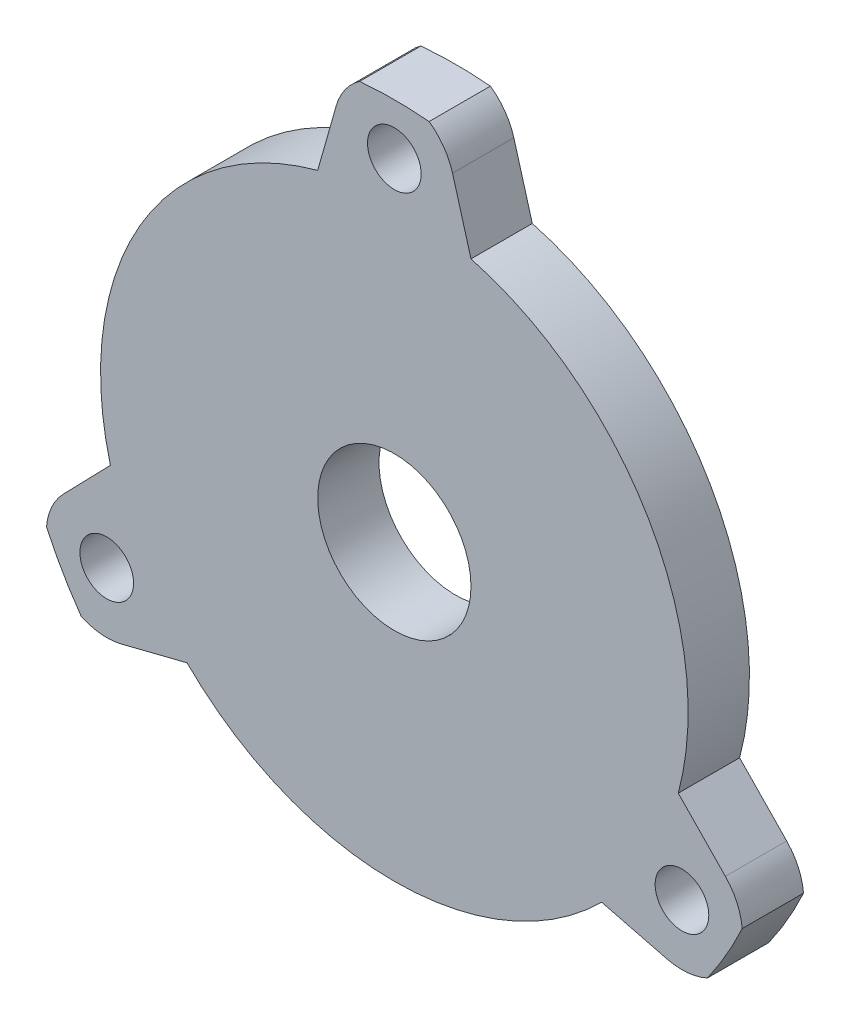
ISO-10303-21;
HEADER;
FILE_DESCRIPTION(('STEP AP214'),'2;1');
FILE_NAME('part.step','',(''),(''),'','','');
FILE_SCHEMA(('AUTOMOTIVE_DESIGN { 1 0 10303 214 1 1 1 1 }'));
ENDSEC;
DATA;
#1=APPLICATION_CONTEXT('core data for automotive mechanical design processes');
#2=APPLICATION_PROTOCOL_DEFINITION('international standard','automotive_design',2000,#1);
#3=PRODUCT_CONTEXT('',#1,'mechanical');
#4=PRODUCT('Part','Part','',(#3));
#5=PRODUCT_RELATED_PRODUCT_CATEGORY('part','',(#4));
#6=PRODUCT_DEFINITION_FORMATION('','',#4);
#7=PRODUCT_DEFINITION_CONTEXT('part definition',#1,'design');
#8=PRODUCT_DEFINITION('design','',#6,#7);
#9=PRODUCT_DEFINITION_SHAPE('','',#8);
#10=(LENGTH_UNIT() NAMED_UNIT(*) SI_UNIT(.MILLI.,.METRE.));
#11=(NAMED_UNIT(*) PLANE_ANGLE_UNIT() SI_UNIT($,.RADIAN.));
#12=(NAMED_UNIT(*) SI_UNIT($,.STERADIAN.) SOLID_ANGLE_UNIT());
#13=UNCERTAINTY_MEASURE_WITH_UNIT(LENGTH_MEASURE(1.E-05),#10,'distance_accuracy_value','');
#14=(GEOMETRIC_REPRESENTATION_CONTEXT(3) GLOBAL_UNCERTAINTY_ASSIGNED_CONTEXT((#13)) GLOBAL_UNIT_ASSIGNED_CONTEXT((#10,
#11,#12)) REPRESENTATION_CONTEXT('',''));
#15=CARTESIAN_POINT('',(0.,0.,0.));
#16=DIRECTION('',(0.,0.,1.));
#17=DIRECTION('',(1.,0.,0.));
#18=AXIS2_PLACEMENT_3D('',#15,#16,#17);
#19=CARTESIAN_POINT('',(0.,0.,6.));
#20=DIRECTION('',(0.,0.,1.));
#21=DIRECTION('',(1.,0.,0.));
#22=AXIS2_PLACEMENT_3D('',#19,#20,#21);
#23=PLANE('',#22);
#24=CARTESIAN_POINT('',(0.,0.,6.));
#25=DIRECTION('',(0.,0.,1.));
#26=DIRECTION('',(1.,0.,0.));
#27=AXIS2_PLACEMENT_3D('',#24,#25,#26);
#28=CIRCLE('',#27,15.);
#29=CARTESIAN_POINT('',(15.,0.,6.));
#30=VERTEX_POINT('',#29);
#31=EDGE_CURVE('E282',#30,#30,#28,.T.);
#32=ORIENTED_EDGE('',*,*,#31,.F.);
#33=EDGE_LOOP('',(#32));
#34=FACE_BOUND('',#33,.T.);
#35=CARTESIAN_POINT('',(0.,65.,6.));
#36=DIRECTION('',(0.,0.,1.));
#37=DIRECTION('',(1.,0.,0.));
#38=AXIS2_PLACEMENT_3D('',#35,#36,#37);
#39=CIRCLE('',#38,5.25);
#40=CARTESIAN_POINT('',(5.25,65.,6.));
#41=VERTEX_POINT('',#40);
#42=EDGE_CURVE('E273',#41,#41,#39,.T.);
#43=ORIENTED_EDGE('',*,*,#42,.F.);
#44=EDGE_LOOP('',(#43));
#45=FACE_BOUND('',#44,.T.);
#46=CARTESIAN_POINT('',(56.2916512459884,-32.5000000000003,6.));
#47=DIRECTION('',(0.,0.,1.));
#48=DIRECTION('',(-0.500000000000004,-0.866025403784436,0.));
#49=AXIS2_PLACEMENT_3D('',#46,#47,#48);
#50=CIRCLE('',#49,5.25);
#51=CARTESIAN_POINT('',(53.6666512459883,-37.0466333698686,6.));
#52=VERTEX_POINT('',#51);
#53=EDGE_CURVE('E267',#52,#52,#50,.T.);
#54=ORIENTED_EDGE('',*,*,#53,.F.);
#55=EDGE_LOOP('',(#54));
#56=FACE_BOUND('',#55,.T.);
#57=CARTESIAN_POINT('',(-56.2916512459888,-32.4999999999995,6.));
#58=DIRECTION('',(0.,0.,1.));
#59=DIRECTION('',(-0.499999999999992,0.866025403784443,0.));
#60=AXIS2_PLACEMENT_3D('',#57,#58,#59);
#61=CIRCLE('',#60,5.25);
#62=CARTESIAN_POINT('',(-58.9166512459888,-27.9533666301312,6.));
#63=VERTEX_POINT('',#62);
#64=EDGE_CURVE('E244',#63,#63,#61,.T.);
#65=ORIENTED_EDGE('',*,*,#64,.F.);
#66=EDGE_LOOP('',(#65));
#67=FACE_BOUND('',#66,.T.);
#68=CARTESIAN_POINT('',(0.,0.,6.));
#69=DIRECTION('',(0.,0.,1.));
#70=DIRECTION('',(1.,0.,0.));
#71=AXIS2_PLACEMENT_3D('',#68,#69,#70);
#72=CIRCLE('',#71,75.);
#73=CARTESIAN_POINT('',(-68.0849220214744,-31.4554191409008,6.));
#74=VERTEX_POINT('',#73);
#75=CARTESIAN_POINT('',(-61.2836530734428,-43.2355625148316,6.));
#76=VERTEX_POINT('',#75);
#77=EDGE_CURVE('E292',#74,#76,#72,.T.);
#78=ORIENTED_EDGE('',*,*,#77,.T.);
#79=CARTESIAN_POINT('',(-56.291651245987,-32.5000000000008,6.));
#80=DIRECTION('',(0.,0.,1.));
#81=DIRECTION('',(1.,0.,0.));
#82=AXIS2_PLACEMENT_3D('',#79,#80,#81);
#83=CIRCLE('',#82,11.8394419106291);
#84=CARTESIAN_POINT('',(-53.3956996676327,-43.9798017931934,6.));
#85=VERTEX_POINT('',#84);
#86=EDGE_CURVE('E208',#76,#85,#83,.T.);
#87=ORIENTED_EDGE('',*,*,#86,.T.);
#88=DIRECTION('',(0.969623558259648,0.244602034472117,0.));
#89=VECTOR('',#88,1.);
#90=CARTESIAN_POINT('',(-42.1842541118638,-41.1515470865559,6.));
#91=LINE('',#90,#89);
#92=CARTESIAN_POINT('',(-40.5722113075722,-40.7448851957355,6.));
#93=VERTEX_POINT('',#92);
#94=EDGE_CURVE('E184',#85,#93,#91,.T.);
#95=ORIENTED_EDGE('',*,*,#94,.T.);
#96=CARTESIAN_POINT('',(0.,0.,6.));
#97=DIRECTION('',(0.,0.,1.));
#98=DIRECTION('',(1.,0.,0.));
#99=AXIS2_PLACEMENT_3D('',#96,#97,#98);
#100=CIRCLE('',#99,57.5);
#101=CARTESIAN_POINT('',(40.5722113075749,-40.7448851957339,6.));
#102=VERTEX_POINT('',#101);
#103=EDGE_CURVE('E236',#93,#102,#100,.T.);
#104=ORIENTED_EDGE('',*,*,#103,.T.);
#105=DIRECTION('',(-0.969623558259649,0.244602034472112,0.));
#106=VECTOR('',#105,1.);
#107=CARTESIAN_POINT('',(42.1842541118637,-41.1515470865536,6.));
#108=LINE('',#107,#106);
#109=CARTESIAN_POINT('',(53.3956996676355,-43.9798017931918,6.));
#110=VERTEX_POINT('',#109);
#111=EDGE_CURVE('E233',#110,#102,#108,.T.);
#112=ORIENTED_EDGE('',*,*,#111,.F.);
#113=CARTESIAN_POINT('',(56.2916512459898,-32.4999999999991,6.));
#114=DIRECTION('',(0.,0.,1.));
#115=DIRECTION('',(1.,0.,0.));
#116=AXIS2_PLACEMENT_3D('',#113,#114,#115);
#117=CIRCLE('',#116,11.8394419106291);
#118=CARTESIAN_POINT('',(61.2836530734431,-43.2355625148311,6.));
#119=VERTEX_POINT('',#118);
#120=EDGE_CURVE('E230',#110,#119,#117,.T.);
#121=ORIENTED_EDGE('',*,*,#120,.T.);
#122=CARTESIAN_POINT('',(68.0849220214768,-31.4554191408956,6.));
#123=VERTEX_POINT('',#122);
#124=EDGE_CURVE('E293',#119,#123,#72,.T.);
#125=ORIENTED_EDGE('',*,*,#124,.T.);
#126=CARTESIAN_POINT('',(64.7854754401277,-24.2521314684183,6.));
#127=VERTEX_POINT('',#126);
#128=EDGE_CURVE('E229',#123,#127,#117,.T.);
#129=ORIENTED_EDGE('',*,*,#128,.T.);
#130=DIRECTION('',(-0.696643354800034,0.717417616324658,0.));
#131=VECTOR('',#130,1.);
#132=CARTESIAN_POINT('',(125.365296859559,-86.6384741797148,6.));
#133=LINE('',#132,#131);
#134=CARTESIAN_POINT('',(55.5722113075749,-14.7641230822008,6.));
#135=VERTEX_POINT('',#134);
#136=EDGE_CURVE('E226',#127,#135,#133,.T.);
#137=ORIENTED_EDGE('',*,*,#136,.T.);
#138=CARTESIAN_POINT('',(0.,0.,6.));
#139=DIRECTION('',(0.,0.,1.));
#140=DIRECTION('',(1.,0.,0.));
#141=AXIS2_PLACEMENT_3D('',#138,#139,#140);
#142=CIRCLE('',#141,57.5);
#143=CARTESIAN_POINT('',(15.,55.5090082779363,6.));
#144=VERTEX_POINT('',#143);
#145=EDGE_CURVE('E223',#135,#144,#142,.T.);
#146=ORIENTED_EDGE('',*,*,#145,.T.);
#147=DIRECTION('',(0.272980203459618,-0.962019650796773,0.));
#148=VECTOR('',#147,1.);
#149=CARTESIAN_POINT('',(83.1810427476952,-184.770331043461,6.));
#150=LINE('',#149,#148);
#151=CARTESIAN_POINT('',(11.3897757724921,68.2319332616117,6.));
#152=VERTEX_POINT('',#151);
#153=EDGE_CURVE('E220',#152,#144,#150,.T.);
#154=ORIENTED_EDGE('',*,*,#153,.F.);
#155=CARTESIAN_POINT('',(0.,64.9999999999999,6.));
#156=DIRECTION('',(0.,0.,1.));
#157=DIRECTION('',(1.,0.,0.));
#158=AXIS2_PLACEMENT_3D('',#155,#156,#157);
#159=CIRCLE('',#158,11.8394419106291);
#160=CARTESIAN_POINT('',(6.80126894803267,74.6909816557295,6.));
#161=VERTEX_POINT('',#160);
#162=EDGE_CURVE('E217',#152,#161,#159,.T.);
#163=ORIENTED_EDGE('',*,*,#162,.T.);
#164=CARTESIAN_POINT('',(-6.80126894803272,74.6909816557295,6.));
#165=VERTEX_POINT('',#164);
#166=EDGE_CURVE('E288',#161,#165,#72,.T.);
#167=ORIENTED_EDGE('',*,*,#166,.T.);
#168=CARTESIAN_POINT('',(-11.3897757724922,68.2319332616117,6.));
#169=VERTEX_POINT('',#168);
#170=EDGE_CURVE('E216',#165,#169,#159,.T.);
#171=ORIENTED_EDGE('',*,*,#170,.T.);
#172=DIRECTION('',(-0.272980203459615,-0.962019650796774,0.));
#173=VECTOR('',#172,1.);
#174=CARTESIAN_POINT('',(-83.1810427476943,-184.770331043461,6.));
#175=LINE('',#174,#173);
#176=CARTESIAN_POINT('',(-15.,55.5090082779363,6.));
#177=VERTEX_POINT('',#176);
#178=EDGE_CURVE('E213',#169,#177,#175,.T.);
#179=ORIENTED_EDGE('',*,*,#178,.T.);
#180=CARTESIAN_POINT('',(0.,0.,6.));
#181=DIRECTION('',(0.,0.,1.));
#182=DIRECTION('',(1.,0.,0.));
#183=AXIS2_PLACEMENT_3D('',#180,#181,#182);
#184=CIRCLE('',#183,57.5);
#185=CARTESIAN_POINT('',(-55.5722113075722,-14.7641230822023,6.));
#186=VERTEX_POINT('',#185);
#187=EDGE_CURVE('E210',#177,#186,#184,.T.);
#188=ORIENTED_EDGE('',*,*,#187,.T.);
#189=DIRECTION('',(0.696643354800031,0.717417616324661,0.));
#190=VECTOR('',#189,1.);
#191=CARTESIAN_POINT('',(-125.365296859557,-86.6384741797178,6.));
#192=LINE('',#191,#190);
#193=CARTESIAN_POINT('',(-64.7854754401249,-24.2521314684199,6.));
#194=VERTEX_POINT('',#193);
#195=EDGE_CURVE('E207',#194,#186,#192,.T.);
#196=ORIENTED_EDGE('',*,*,#195,.F.);
#197=EDGE_CURVE('E162',#194,#74,#83,.T.);
#198=ORIENTED_EDGE('',*,*,#197,.T.);
#199=EDGE_LOOP('',(#78,#87,#95,#104,#112,#121,#125,#129,#137,#146,#154,#163,#167,#171,#179,#188,
#196,#198));
#200=FACE_BOUND('',#199,.T.);
#201=ADVANCED_FACE('F32',(#34,#45,#56,#67,#200),#23,.T.);
#202=CARTESIAN_POINT('',(0.,0.,-6.));
#203=DIRECTION('',(0.,0.,1.));
#204=DIRECTION('',(1.,0.,0.));
#205=AXIS2_PLACEMENT_3D('',#202,#203,#204);
#206=PLANE('',#205);
#207=CARTESIAN_POINT('',(0.,0.,-6.));
#208=DIRECTION('',(0.,0.,1.));
#209=DIRECTION('',(1.,0.,0.));
#210=AXIS2_PLACEMENT_3D('',#207,#208,#209);
#211=CIRCLE('',#210,15.);
#212=CARTESIAN_POINT('',(15.,0.,-6.));
#213=VERTEX_POINT('',#212);
#214=EDGE_CURVE('E279',#213,#213,#211,.T.);
#215=ORIENTED_EDGE('',*,*,#214,.T.);
#216=EDGE_LOOP('',(#215));
#217=FACE_BOUND('',#216,.T.);
#218=CARTESIAN_POINT('',(0.,65.,-6.));
#219=DIRECTION('',(0.,0.,1.));
#220=DIRECTION('',(1.,0.,0.));
#221=AXIS2_PLACEMENT_3D('',#218,#219,#220);
#222=CIRCLE('',#221,5.25);
#223=CARTESIAN_POINT('',(5.25,65.,-6.));
#224=VERTEX_POINT('',#223);
#225=EDGE_CURVE('E276',#224,#224,#222,.T.);
#226=ORIENTED_EDGE('',*,*,#225,.T.);
#227=EDGE_LOOP('',(#226));
#228=FACE_BOUND('',#227,.T.);
#229=CARTESIAN_POINT('',(56.2916512459884,-32.5000000000003,-6.));
#230=DIRECTION('',(0.,0.,1.));
#231=DIRECTION('',(-0.500000000000004,-0.866025403784436,0.));
#232=AXIS2_PLACEMENT_3D('',#229,#230,#231);
#233=CIRCLE('',#232,5.25);
#234=CARTESIAN_POINT('',(53.6666512459883,-37.0466333698686,-6.));
#235=VERTEX_POINT('',#234);
#236=EDGE_CURVE('E270',#235,#235,#233,.T.);
#237=ORIENTED_EDGE('',*,*,#236,.T.);
#238=EDGE_LOOP('',(#237));
#239=FACE_BOUND('',#238,.T.);
#240=CARTESIAN_POINT('',(-56.2916512459888,-32.4999999999995,-6.));
#241=DIRECTION('',(0.,0.,1.));
#242=DIRECTION('',(-0.499999999999992,0.866025403784443,0.));
#243=AXIS2_PLACEMENT_3D('',#240,#241,#242);
#244=CIRCLE('',#243,5.25);
#245=CARTESIAN_POINT('',(-58.9166512459888,-27.9533666301312,-6.));
#246=VERTEX_POINT('',#245);
#247=EDGE_CURVE('E264',#246,#246,#244,.T.);
#248=ORIENTED_EDGE('',*,*,#247,.T.);
#249=EDGE_LOOP('',(#248));
#250=FACE_BOUND('',#249,.T.);
#251=CARTESIAN_POINT('',(-56.291651245987,-32.5000000000008,-6.));
#252=DIRECTION('',(0.,0.,1.));
#253=DIRECTION('',(1.,0.,0.));
#254=AXIS2_PLACEMENT_3D('',#251,#252,#253);
#255=CIRCLE('',#254,11.8394419106291);
#256=CARTESIAN_POINT('',(-61.2836530734428,-43.2355625148316,-6.));
#257=VERTEX_POINT('',#256);
#258=CARTESIAN_POINT('',(-53.3956996676327,-43.9798017931934,-6.));
#259=VERTEX_POINT('',#258);
#260=EDGE_CURVE('E182',#257,#259,#255,.T.);
#261=ORIENTED_EDGE('',*,*,#260,.F.);
#262=CARTESIAN_POINT('',(0.,0.,-6.));
#263=DIRECTION('',(0.,0.,1.));
#264=DIRECTION('',(1.,0.,0.));
#265=AXIS2_PLACEMENT_3D('',#262,#263,#264);
#266=CIRCLE('',#265,75.);
#267=CARTESIAN_POINT('',(-68.0849220214744,-31.4554191409008,-6.));
#268=VERTEX_POINT('',#267);
#269=EDGE_CURVE('E181',#268,#257,#266,.T.);
#270=ORIENTED_EDGE('',*,*,#269,.F.);
#271=CARTESIAN_POINT('',(-64.7854754401249,-24.2521314684199,-6.));
#272=VERTEX_POINT('',#271);
#273=EDGE_CURVE('E159',#272,#268,#255,.T.);
#274=ORIENTED_EDGE('',*,*,#273,.F.);
#275=DIRECTION('',(0.696643354800031,0.717417616324661,0.));
#276=VECTOR('',#275,1.);
#277=CARTESIAN_POINT('',(-125.365296859557,-86.6384741797178,-6.));
#278=LINE('',#277,#276);
#279=CARTESIAN_POINT('',(-55.5722113075722,-14.7641230822023,-6.));
#280=VERTEX_POINT('',#279);
#281=EDGE_CURVE('E171',#272,#280,#278,.T.);
#282=ORIENTED_EDGE('',*,*,#281,.T.);
#283=CARTESIAN_POINT('',(0.,0.,-6.));
#284=DIRECTION('',(0.,0.,1.));
#285=DIRECTION('',(1.,0.,0.));
#286=AXIS2_PLACEMENT_3D('',#283,#284,#285);
#287=CIRCLE('',#286,57.5);
#288=CARTESIAN_POINT('',(-15.,55.5090082779363,-6.));
#289=VERTEX_POINT('',#288);
#290=EDGE_CURVE('E175',#289,#280,#287,.T.);
#291=ORIENTED_EDGE('',*,*,#290,.F.);
#292=DIRECTION('',(-0.272980203459615,-0.962019650796774,0.));
#293=VECTOR('',#292,1.);
#294=CARTESIAN_POINT('',(-83.1810427476943,-184.770331043461,-6.));
#295=LINE('',#294,#293);
#296=CARTESIAN_POINT('',(-11.3897757724922,68.2319332616117,-6.));
#297=VERTEX_POINT('',#296);
#298=EDGE_CURVE('E187',#297,#289,#295,.T.);
#299=ORIENTED_EDGE('',*,*,#298,.F.);
#300=CARTESIAN_POINT('',(0.,64.9999999999999,-6.));
#301=DIRECTION('',(0.,0.,1.));
#302=DIRECTION('',(1.,0.,0.));
#303=AXIS2_PLACEMENT_3D('',#300,#301,#302);
#304=CIRCLE('',#303,11.8394419106291);
#305=CARTESIAN_POINT('',(-6.80126894803272,74.6909816557295,-6.));
#306=VERTEX_POINT('',#305);
#307=EDGE_CURVE('E189',#306,#297,#304,.T.);
#308=ORIENTED_EDGE('',*,*,#307,.F.);
#309=CARTESIAN_POINT('',(6.80126894803267,74.6909816557295,-6.));
#310=VERTEX_POINT('',#309);
#311=EDGE_CURVE('E294',#310,#306,#266,.T.);
#312=ORIENTED_EDGE('',*,*,#311,.F.);
#313=CARTESIAN_POINT('',(11.3897757724921,68.2319332616117,-6.));
#314=VERTEX_POINT('',#313);
#315=EDGE_CURVE('E55',#314,#310,#304,.T.);
#316=ORIENTED_EDGE('',*,*,#315,.F.);
#317=DIRECTION('',(0.272980203459618,-0.962019650796773,0.));
#318=VECTOR('',#317,1.);
#319=CARTESIAN_POINT('',(83.1810427476952,-184.770331043461,-6.));
#320=LINE('',#319,#318);
#321=CARTESIAN_POINT('',(15.,55.5090082779363,-6.));
#322=VERTEX_POINT('',#321);
#323=EDGE_CURVE('E191',#314,#322,#320,.T.);
#324=ORIENTED_EDGE('',*,*,#323,.T.);
#325=CARTESIAN_POINT('',(0.,0.,-6.));
#326=DIRECTION('',(0.,0.,1.));
#327=DIRECTION('',(1.,0.,0.));
#328=AXIS2_PLACEMENT_3D('',#325,#326,#327);
#329=CIRCLE('',#328,57.5);
#330=CARTESIAN_POINT('',(55.5722113075749,-14.7641230822008,-6.));
#331=VERTEX_POINT('',#330);
#332=EDGE_CURVE('E194',#331,#322,#329,.T.);
#333=ORIENTED_EDGE('',*,*,#332,.F.);
#334=DIRECTION('',(-0.696643354800034,0.717417616324658,0.));
#335=VECTOR('',#334,1.);
#336=CARTESIAN_POINT('',(125.365296859559,-86.6384741797148,-6.));
#337=LINE('',#336,#335);
#338=CARTESIAN_POINT('',(64.7854754401277,-24.2521314684183,-6.));
#339=VERTEX_POINT('',#338);
#340=EDGE_CURVE('E196',#339,#331,#337,.T.);
#341=ORIENTED_EDGE('',*,*,#340,.F.);
#342=CARTESIAN_POINT('',(56.2916512459898,-32.4999999999991,-6.));
#343=DIRECTION('',(0.,0.,1.));
#344=DIRECTION('',(1.,0.,0.));
#345=AXIS2_PLACEMENT_3D('',#342,#343,#344);
#346=CIRCLE('',#345,11.8394419106291);
#347=CARTESIAN_POINT('',(68.0849220214768,-31.4554191408956,-6.));
#348=VERTEX_POINT('',#347);
#349=EDGE_CURVE('E198',#348,#339,#346,.T.);
#350=ORIENTED_EDGE('',*,*,#349,.F.);
#351=CARTESIAN_POINT('',(61.2836530734431,-43.2355625148311,-6.));
#352=VERTEX_POINT('',#351);
#353=EDGE_CURVE('E285',#352,#348,#266,.T.);
#354=ORIENTED_EDGE('',*,*,#353,.F.);
#355=CARTESIAN_POINT('',(53.3956996676355,-43.9798017931918,-6.));
#356=VERTEX_POINT('',#355);
#357=EDGE_CURVE('E47',#356,#352,#346,.T.);
#358=ORIENTED_EDGE('',*,*,#357,.F.);
#359=DIRECTION('',(-0.969623558259649,0.244602034472112,0.));
#360=VECTOR('',#359,1.);
#361=CARTESIAN_POINT('',(42.1842541118637,-41.1515470865536,-6.));
#362=LINE('',#361,#360);
#363=CARTESIAN_POINT('',(40.5722113075749,-40.7448851957339,-6.));
#364=VERTEX_POINT('',#363);
#365=EDGE_CURVE('E200',#356,#364,#362,.T.);
#366=ORIENTED_EDGE('',*,*,#365,.T.);
#367=CARTESIAN_POINT('',(0.,0.,-6.));
#368=DIRECTION('',(0.,0.,1.));
#369=DIRECTION('',(1.,0.,0.));
#370=AXIS2_PLACEMENT_3D('',#367,#368,#369);
#371=CIRCLE('',#370,57.5);
#372=CARTESIAN_POINT('',(-40.5722113075722,-40.7448851957355,-6.));
#373=VERTEX_POINT('',#372);
#374=EDGE_CURVE('E203',#373,#364,#371,.T.);
#375=ORIENTED_EDGE('',*,*,#374,.F.);
#376=DIRECTION('',(0.969623558259648,0.244602034472117,0.));
#377=VECTOR('',#376,1.);
#378=CARTESIAN_POINT('',(-42.1842541118638,-41.1515470865559,-6.));
#379=LINE('',#378,#377);
#380=EDGE_CURVE('E167',#259,#373,#379,.T.);
#381=ORIENTED_EDGE('',*,*,#380,.F.);
#382=EDGE_LOOP('',(#261,#270,#274,#282,#291,#299,#308,#312,#316,#324,#333,#341,#350,#354,#358,
#366,#375,#381));
#383=FACE_BOUND('',#382,.T.);
#384=ADVANCED_FACE('F179',(#217,#228,#239,#250,#383),#206,.F.);
#385=CARTESIAN_POINT('',(0.,0.,6.));
#386=DIRECTION('',(0.,0.,-1.));
#387=DIRECTION('',(-1.,0.,0.));
#388=AXIS2_PLACEMENT_3D('',#385,#386,#387);
#389=CYLINDRICAL_SURFACE('',#388,75.);
#390=DIRECTION('',(0.,0.,1.));
#391=VECTOR('',#390,1.);
#392=CARTESIAN_POINT('',(-68.0849220214744,-31.4554191409009,0.));
#393=LINE('',#392,#391);
#394=EDGE_CURVE('E11',#268,#74,#393,.T.);
#395=ORIENTED_EDGE('',*,*,#394,.F.);
#396=ORIENTED_EDGE('',*,*,#269,.T.);
#397=DIRECTION('',(0.,0.,1.));
#398=VECTOR('',#397,1.);
#399=CARTESIAN_POINT('',(-61.2836530734428,-43.2355625148316,0.));
#400=LINE('',#399,#398);
#401=EDGE_CURVE('E40',#76,#257,#400,.F.);
#402=ORIENTED_EDGE('',*,*,#401,.F.);
#403=ORIENTED_EDGE('',*,*,#77,.F.);
#404=EDGE_LOOP('',(#395,#396,#402,#403));
#405=FACE_BOUND('',#404,.T.);
#406=ADVANCED_FACE('F34',(#405),#389,.T.);
#407=DIRECTION('',(0.,0.,1.));
#408=VECTOR('',#407,1.);
#409=CARTESIAN_POINT('',(61.2836530734431,-43.2355625148311,0.));
#410=LINE('',#409,#408);
#411=EDGE_CURVE('E302',#352,#119,#410,.T.);
#412=ORIENTED_EDGE('',*,*,#411,.F.);
#413=ORIENTED_EDGE('',*,*,#353,.T.);
#414=DIRECTION('',(0.,0.,1.));
#415=VECTOR('',#414,1.);
#416=CARTESIAN_POINT('',(68.0849220214768,-31.4554191408956,0.));
#417=LINE('',#416,#415);
#418=EDGE_CURVE('E300',#123,#348,#417,.F.);
#419=ORIENTED_EDGE('',*,*,#418,.F.);
#420=ORIENTED_EDGE('',*,*,#124,.F.);
#421=EDGE_LOOP('',(#412,#413,#419,#420));
#422=FACE_BOUND('',#421,.T.);
#423=ADVANCED_FACE('F317',(#422),#389,.T.);
#424=DIRECTION('',(0.,0.,1.));
#425=VECTOR('',#424,1.);
#426=CARTESIAN_POINT('',(6.80126894803271,74.6909816557295,0.));
#427=LINE('',#426,#425);
#428=EDGE_CURVE('E298',#310,#161,#427,.T.);
#429=ORIENTED_EDGE('',*,*,#428,.F.);
#430=ORIENTED_EDGE('',*,*,#311,.T.);
#431=DIRECTION('',(0.,0.,1.));
#432=VECTOR('',#431,1.);
#433=CARTESIAN_POINT('',(-6.80126894803276,74.6909816557295,0.));
#434=LINE('',#433,#432);
#435=EDGE_CURVE('E291',#165,#306,#434,.F.);
#436=ORIENTED_EDGE('',*,*,#435,.F.);
#437=ORIENTED_EDGE('',*,*,#166,.F.);
#438=EDGE_LOOP('',(#429,#430,#436,#437));
#439=FACE_BOUND('',#438,.T.);
#440=ADVANCED_FACE('F352',(#439),#389,.T.);
#441=CARTESIAN_POINT('',(0.,0.,6.));
#442=DIRECTION('',(0.,0.,-1.));
#443=DIRECTION('',(-1.,0.,0.));
#444=AXIS2_PLACEMENT_3D('',#441,#442,#443);
#445=CYLINDRICAL_SURFACE('',#444,15.);
#446=ORIENTED_EDGE('',*,*,#31,.T.);
#447=EDGE_LOOP('',(#446));
#448=FACE_BOUND('',#447,.T.);
#449=ORIENTED_EDGE('',*,*,#214,.F.);
#450=EDGE_LOOP('',(#449));
#451=FACE_BOUND('',#450,.T.);
#452=ADVANCED_FACE('F380',(#448,#451),#445,.F.);
#453=CARTESIAN_POINT('',(0.,65.,-6.));
#454=DIRECTION('',(0.,0.,1.));
#455=DIRECTION('',(1.,0.,0.));
#456=AXIS2_PLACEMENT_3D('',#453,#454,#455);
#457=CYLINDRICAL_SURFACE('',#456,5.25);
#458=ORIENTED_EDGE('',*,*,#225,.F.);
#459=EDGE_LOOP('',(#458));
#460=FACE_BOUND('',#459,.T.);
#461=ORIENTED_EDGE('',*,*,#42,.T.);
#462=EDGE_LOOP('',(#461));
#463=FACE_BOUND('',#462,.T.);
#464=ADVANCED_FACE('F383',(#460,#463),#457,.F.);
#465=CARTESIAN_POINT('',(56.2916512459884,-32.5000000000003,-6.));
#466=DIRECTION('',(0.,0.,1.));
#467=DIRECTION('',(1.,0.,0.));
#468=AXIS2_PLACEMENT_3D('',#465,#466,#467);
#469=CYLINDRICAL_SURFACE('',#468,5.25);
#470=ORIENTED_EDGE('',*,*,#236,.F.);
#471=EDGE_LOOP('',(#470));
#472=FACE_BOUND('',#471,.T.);
#473=ORIENTED_EDGE('',*,*,#53,.T.);
#474=EDGE_LOOP('',(#473));
#475=FACE_BOUND('',#474,.T.);
#476=ADVANCED_FACE('F387',(#472,#475),#469,.F.);
#477=CARTESIAN_POINT('',(-56.2916512459888,-32.4999999999995,-6.));
#478=DIRECTION('',(0.,0.,1.));
#479=DIRECTION('',(1.,0.,0.));
#480=AXIS2_PLACEMENT_3D('',#477,#478,#479);
#481=CYLINDRICAL_SURFACE('',#480,5.25);
#482=ORIENTED_EDGE('',*,*,#247,.F.);
#483=EDGE_LOOP('',(#482));
#484=FACE_BOUND('',#483,.T.);
#485=ORIENTED_EDGE('',*,*,#64,.T.);
#486=EDGE_LOOP('',(#485));
#487=FACE_BOUND('',#486,.T.);
#488=ADVANCED_FACE('F391',(#484,#487),#481,.F.);
#489=CARTESIAN_POINT('',(0.,64.9999999999999,-6.));
#490=DIRECTION('',(0.,0.,1.));
#491=DIRECTION('',(1.,0.,0.));
#492=AXIS2_PLACEMENT_3D('',#489,#490,#491);
#493=CYLINDRICAL_SURFACE('',#492,11.8394419106291);
#494=ORIENTED_EDGE('',*,*,#435,.T.);
#495=ORIENTED_EDGE('',*,*,#307,.T.);
#496=DIRECTION('',(0.,0.,1.));
#497=VECTOR('',#496,1.);
#498=CARTESIAN_POINT('',(-11.3897757724922,68.2319332616117,-6.));
#499=LINE('',#498,#497);
#500=EDGE_CURVE('E259',#297,#169,#499,.T.);
#501=ORIENTED_EDGE('',*,*,#500,.T.);
#502=ORIENTED_EDGE('',*,*,#170,.F.);
#503=EDGE_LOOP('',(#494,#495,#501,#502));
#504=FACE_BOUND('',#503,.T.);
#505=ADVANCED_FACE('F348',(#504),#493,.T.);
#506=CARTESIAN_POINT('',(-56.291651245987,-32.5000000000008,-6.));
#507=DIRECTION('',(0.,0.,1.));
#508=DIRECTION('',(1.,0.,0.));
#509=AXIS2_PLACEMENT_3D('',#506,#507,#508);
#510=CYLINDRICAL_SURFACE('',#509,11.8394419106291);
#511=ORIENTED_EDGE('',*,*,#394,.T.);
#512=ORIENTED_EDGE('',*,*,#197,.F.);
#513=DIRECTION('',(0.,0.,1.));
#514=VECTOR('',#513,1.);
#515=CARTESIAN_POINT('',(-64.7854754401249,-24.2521314684199,-6.));
#516=LINE('',#515,#514);
#517=EDGE_CURVE('E155',#272,#194,#516,.T.);
#518=ORIENTED_EDGE('',*,*,#517,.F.);
#519=ORIENTED_EDGE('',*,*,#273,.T.);
#520=EDGE_LOOP('',(#511,#512,#518,#519));
#521=FACE_BOUND('',#520,.T.);
#522=ADVANCED_FACE('F157',(#521),#510,.T.);
#523=CARTESIAN_POINT('',(-125.365296859557,-86.6384741797178,-6.));
#524=DIRECTION('',(0.717417616324661,-0.696643354800031,0.));
#525=DIRECTION('',(0.696643354800031,0.717417616324661,0.));
#526=AXIS2_PLACEMENT_3D('',#523,#524,#525);
#527=PLANE('',#526);
#528=ORIENTED_EDGE('',*,*,#195,.T.);
#529=DIRECTION('',(0.,0.,1.));
#530=VECTOR('',#529,1.);
#531=CARTESIAN_POINT('',(-55.5722113075722,-14.7641230822023,-6.));
#532=LINE('',#531,#530);
#533=EDGE_CURVE('E166',#280,#186,#532,.T.);
#534=ORIENTED_EDGE('',*,*,#533,.F.);
#535=ORIENTED_EDGE('',*,*,#281,.F.);
#536=ORIENTED_EDGE('',*,*,#517,.T.);
#537=EDGE_LOOP('',(#528,#534,#535,#536));
#538=FACE_BOUND('',#537,.T.);
#539=ADVANCED_FACE('F172',(#538),#527,.F.);
#540=CARTESIAN_POINT('',(0.,0.,-6.));
#541=DIRECTION('',(0.,0.,1.));
#542=DIRECTION('',(1.,0.,0.));
#543=AXIS2_PLACEMENT_3D('',#540,#541,#542);
#544=CYLINDRICAL_SURFACE('',#543,57.5);
#545=ORIENTED_EDGE('',*,*,#187,.F.);
#546=DIRECTION('',(0.,0.,1.));
#547=VECTOR('',#546,1.);
#548=CARTESIAN_POINT('',(-15.,55.5090082779363,-6.));
#549=LINE('',#548,#547);
#550=EDGE_CURVE('E261',#289,#177,#549,.T.);
#551=ORIENTED_EDGE('',*,*,#550,.F.);
#552=ORIENTED_EDGE('',*,*,#290,.T.);
#553=ORIENTED_EDGE('',*,*,#533,.T.);
#554=EDGE_LOOP('',(#545,#551,#552,#553));
#555=FACE_BOUND('',#554,.T.);
#556=ADVANCED_FACE('F340',(#555),#544,.T.);
#557=CARTESIAN_POINT('',(-83.1810427476943,-184.770331043461,-6.));
#558=DIRECTION('',(-0.962019650796774,0.272980203459614,0.));
#559=DIRECTION('',(-0.272980203459615,-0.962019650796774,0.));
#560=AXIS2_PLACEMENT_3D('',#557,#558,#559);
#561=PLANE('',#560);
#562=ORIENTED_EDGE('',*,*,#178,.F.);
#563=ORIENTED_EDGE('',*,*,#500,.F.);
#564=ORIENTED_EDGE('',*,*,#298,.T.);
#565=ORIENTED_EDGE('',*,*,#550,.T.);
#566=EDGE_LOOP('',(#562,#563,#564,#565));
#567=FACE_BOUND('',#566,.T.);
#568=ADVANCED_FACE('F346',(#567),#561,.T.);
#569=CARTESIAN_POINT('',(56.2916512459898,-32.4999999999991,-6.));
#570=DIRECTION('',(0.,0.,1.));
#571=DIRECTION('',(1.,0.,0.));
#572=AXIS2_PLACEMENT_3D('',#569,#570,#571);
#573=CYLINDRICAL_SURFACE('',#572,11.8394419106291);
#574=ORIENTED_EDGE('',*,*,#418,.T.);
#575=ORIENTED_EDGE('',*,*,#349,.T.);
#576=DIRECTION('',(0.,0.,1.));
#577=VECTOR('',#576,1.);
#578=CARTESIAN_POINT('',(64.7854754401277,-24.2521314684183,-6.));
#579=LINE('',#578,#577);
#580=EDGE_CURVE('E251',#339,#127,#579,.T.);
#581=ORIENTED_EDGE('',*,*,#580,.T.);
#582=ORIENTED_EDGE('',*,*,#128,.F.);
#583=EDGE_LOOP('',(#574,#575,#581,#582));
#584=FACE_BOUND('',#583,.T.);
#585=ADVANCED_FACE('F325',(#584),#573,.T.);
#586=ORIENTED_EDGE('',*,*,#428,.T.);
#587=ORIENTED_EDGE('',*,*,#162,.F.);
#588=DIRECTION('',(0.,0.,1.));
#589=VECTOR('',#588,1.);
#590=CARTESIAN_POINT('',(11.3897757724921,68.2319332616117,-6.));
#591=LINE('',#590,#589);
#592=EDGE_CURVE('E257',#314,#152,#591,.T.);
#593=ORIENTED_EDGE('',*,*,#592,.F.);
#594=ORIENTED_EDGE('',*,*,#315,.T.);
#595=EDGE_LOOP('',(#586,#587,#593,#594));
#596=FACE_BOUND('',#595,.T.);
#597=ADVANCED_FACE('F355',(#596),#493,.T.);
#598=CARTESIAN_POINT('',(83.1810427476952,-184.770331043461,-6.));
#599=DIRECTION('',(-0.962019650796773,-0.272980203459618,0.));
#600=DIRECTION('',(0.272980203459618,-0.962019650796773,0.));
#601=AXIS2_PLACEMENT_3D('',#598,#599,#600);
#602=PLANE('',#601);
#603=ORIENTED_EDGE('',*,*,#153,.T.);
#604=DIRECTION('',(0.,0.,1.));
#605=VECTOR('',#604,1.);
#606=CARTESIAN_POINT('',(15.,55.5090082779363,-6.));
#607=LINE('',#606,#605);
#608=EDGE_CURVE('E255',#322,#144,#607,.T.);
#609=ORIENTED_EDGE('',*,*,#608,.F.);
#610=ORIENTED_EDGE('',*,*,#323,.F.);
#611=ORIENTED_EDGE('',*,*,#592,.T.);
#612=EDGE_LOOP('',(#603,#609,#610,#611));
#613=FACE_BOUND('',#612,.T.);
#614=ADVANCED_FACE('F359',(#613),#602,.F.);
#615=CARTESIAN_POINT('',(0.,0.,-6.));
#616=DIRECTION('',(0.,0.,1.));
#617=DIRECTION('',(1.,0.,0.));
#618=AXIS2_PLACEMENT_3D('',#615,#616,#617);
#619=CYLINDRICAL_SURFACE('',#618,57.5);
#620=ORIENTED_EDGE('',*,*,#145,.F.);
#621=DIRECTION('',(0.,0.,1.));
#622=VECTOR('',#621,1.);
#623=CARTESIAN_POINT('',(55.5722113075749,-14.7641230822008,-6.));
#624=LINE('',#623,#622);
#625=EDGE_CURVE('E253',#331,#135,#624,.T.);
#626=ORIENTED_EDGE('',*,*,#625,.F.);
#627=ORIENTED_EDGE('',*,*,#332,.T.);
#628=ORIENTED_EDGE('',*,*,#608,.T.);
#629=EDGE_LOOP('',(#620,#626,#627,#628));
#630=FACE_BOUND('',#629,.T.);
#631=ADVANCED_FACE('F361',(#630),#619,.T.);
#632=CARTESIAN_POINT('',(125.365296859559,-86.6384741797148,-6.));
#633=DIRECTION('',(0.717417616324658,0.696643354800034,0.));
#634=DIRECTION('',(-0.696643354800034,0.717417616324658,0.));
#635=AXIS2_PLACEMENT_3D('',#632,#633,#634);
#636=PLANE('',#635);
#637=ORIENTED_EDGE('',*,*,#136,.F.);
#638=ORIENTED_EDGE('',*,*,#580,.F.);
#639=ORIENTED_EDGE('',*,*,#340,.T.);
#640=ORIENTED_EDGE('',*,*,#625,.T.);
#641=EDGE_LOOP('',(#637,#638,#639,#640));
#642=FACE_BOUND('',#641,.T.);
#643=ADVANCED_FACE('F328',(#642),#636,.T.);
#644=ORIENTED_EDGE('',*,*,#401,.T.);
#645=ORIENTED_EDGE('',*,*,#260,.T.);
#646=DIRECTION('',(0.,0.,1.));
#647=VECTOR('',#646,1.);
#648=CARTESIAN_POINT('',(-53.3956996676327,-43.9798017931934,-6.));
#649=LINE('',#648,#647);
#650=EDGE_CURVE('E241',#259,#85,#649,.T.);
#651=ORIENTED_EDGE('',*,*,#650,.T.);
#652=ORIENTED_EDGE('',*,*,#86,.F.);
#653=EDGE_LOOP('',(#644,#645,#651,#652));
#654=FACE_BOUND('',#653,.T.);
#655=ADVANCED_FACE('F305',(#654),#510,.T.);
#656=ORIENTED_EDGE('',*,*,#411,.T.);
#657=ORIENTED_EDGE('',*,*,#120,.F.);
#658=DIRECTION('',(0.,0.,1.));
#659=VECTOR('',#658,1.);
#660=CARTESIAN_POINT('',(53.3956996676355,-43.9798017931918,-6.));
#661=LINE('',#660,#659);
#662=EDGE_CURVE('E249',#356,#110,#661,.T.);
#663=ORIENTED_EDGE('',*,*,#662,.F.);
#664=ORIENTED_EDGE('',*,*,#357,.T.);
#665=EDGE_LOOP('',(#656,#657,#663,#664));
#666=FACE_BOUND('',#665,.T.);
#667=ADVANCED_FACE('F409',(#666),#573,.T.);
#668=CARTESIAN_POINT('',(-42.1842541118638,-41.1515470865559,-6.));
#669=DIRECTION('',(0.244602034472117,-0.969623558259648,0.));
#670=DIRECTION('',(0.969623558259648,0.244602034472117,0.));
#671=AXIS2_PLACEMENT_3D('',#668,#669,#670);
#672=PLANE('',#671);
#673=ORIENTED_EDGE('',*,*,#94,.F.);
#674=ORIENTED_EDGE('',*,*,#650,.F.);
#675=ORIENTED_EDGE('',*,*,#380,.T.);
#676=DIRECTION('',(0.,0.,1.));
#677=VECTOR('',#676,1.);
#678=CARTESIAN_POINT('',(-40.5722113075722,-40.7448851957355,-6.));
#679=LINE('',#678,#677);
#680=EDGE_CURVE('E245',#373,#93,#679,.T.);
#681=ORIENTED_EDGE('',*,*,#680,.T.);
#682=EDGE_LOOP('',(#673,#674,#675,#681));
#683=FACE_BOUND('',#682,.T.);
#684=ADVANCED_FACE('F472',(#683),#672,.T.);
#685=CARTESIAN_POINT('',(0.,0.,-6.));
#686=DIRECTION('',(0.,0.,1.));
#687=DIRECTION('',(1.,0.,0.));
#688=AXIS2_PLACEMENT_3D('',#685,#686,#687);
#689=CYLINDRICAL_SURFACE('',#688,57.5);
#690=ORIENTED_EDGE('',*,*,#103,.F.);
#691=ORIENTED_EDGE('',*,*,#680,.F.);
#692=ORIENTED_EDGE('',*,*,#374,.T.);
#693=DIRECTION('',(0.,0.,1.));
#694=VECTOR('',#693,1.);
#695=CARTESIAN_POINT('',(40.5722113075749,-40.7448851957339,-6.));
#696=LINE('',#695,#694);
#697=EDGE_CURVE('E247',#364,#102,#696,.T.);
#698=ORIENTED_EDGE('',*,*,#697,.T.);
#699=EDGE_LOOP('',(#690,#691,#692,#698));
#700=FACE_BOUND('',#699,.T.);
#701=ADVANCED_FACE('F480',(#700),#689,.T.);
#702=CARTESIAN_POINT('',(42.1842541118637,-41.1515470865536,-6.));
#703=DIRECTION('',(0.244602034472112,0.969623558259649,0.));
#704=DIRECTION('',(-0.969623558259649,0.244602034472112,0.));
#705=AXIS2_PLACEMENT_3D('',#702,#703,#704);
#706=PLANE('',#705);
#707=ORIENTED_EDGE('',*,*,#111,.T.);
#708=ORIENTED_EDGE('',*,*,#697,.F.);
#709=ORIENTED_EDGE('',*,*,#365,.F.);
#710=ORIENTED_EDGE('',*,*,#662,.T.);
#711=EDGE_LOOP('',(#707,#708,#709,#710));
#712=FACE_BOUND('',#711,.T.);
#713=ADVANCED_FACE('F490',(#712),#706,.F.);
#714=CLOSED_SHELL('',(#201,#384,#406,#423,#440,#452,#464,#476,#488,#505,#522,#539,#556,#568,
#585,#597,#614,#631,#643,#655,#667,#684,#701,#713));
#715=MANIFOLD_SOLID_BREP('B2',#714);
#716=ADVANCED_BREP_SHAPE_REPRESENTATION('',(#18,#715),#14);
#717=SHAPE_DEFINITION_REPRESENTATION(#9,#716);
ENDSEC;
END-ISO-10303-21;
